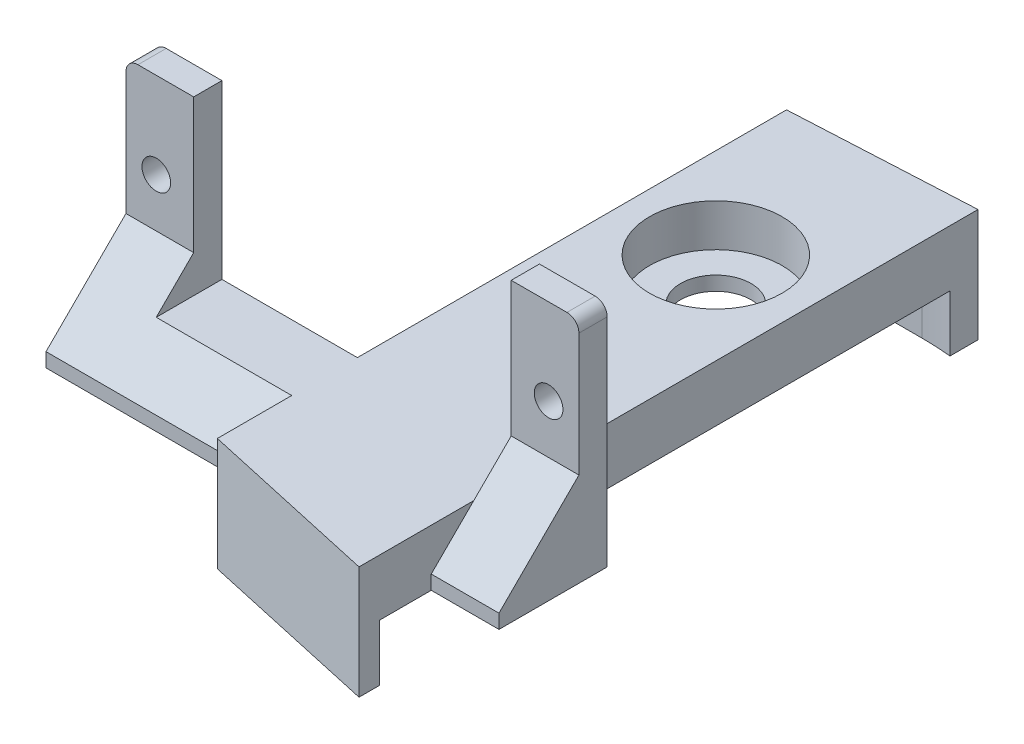
ISO-10303-21;
HEADER;
FILE_DESCRIPTION(('STEP AP214'),'2;1');
FILE_NAME('part.step','',(''),(''),'','','');
FILE_SCHEMA(('AUTOMOTIVE_DESIGN { 1 0 10303 214 1 1 1 1 }'));
ENDSEC;
DATA;
#1=APPLICATION_CONTEXT('core data for automotive mechanical design processes');
#2=APPLICATION_PROTOCOL_DEFINITION('international standard','automotive_design',2000,#1);
#3=PRODUCT_CONTEXT('',#1,'mechanical');
#4=PRODUCT('Part','Part','',(#3));
#5=PRODUCT_RELATED_PRODUCT_CATEGORY('part','',(#4));
#6=PRODUCT_DEFINITION_FORMATION('','',#4);
#7=PRODUCT_DEFINITION_CONTEXT('part definition',#1,'design');
#8=PRODUCT_DEFINITION('design','',#6,#7);
#9=PRODUCT_DEFINITION_SHAPE('','',#8);
#10=(LENGTH_UNIT() NAMED_UNIT(*) SI_UNIT(.MILLI.,.METRE.));
#11=(NAMED_UNIT(*) PLANE_ANGLE_UNIT() SI_UNIT($,.RADIAN.));
#12=(NAMED_UNIT(*) SI_UNIT($,.STERADIAN.) SOLID_ANGLE_UNIT());
#13=UNCERTAINTY_MEASURE_WITH_UNIT(LENGTH_MEASURE(1.E-05),#10,'distance_accuracy_value','');
#14=(GEOMETRIC_REPRESENTATION_CONTEXT(3) GLOBAL_UNCERTAINTY_ASSIGNED_CONTEXT((#13)) GLOBAL_UNIT_ASSIGNED_CONTEXT((#10,
#11,#12)) REPRESENTATION_CONTEXT('',''));
#15=CARTESIAN_POINT('',(0.,0.,0.));
#16=DIRECTION('',(0.,0.,1.));
#17=DIRECTION('',(1.,0.,0.));
#18=AXIS2_PLACEMENT_3D('',#15,#16,#17);
#19=CARTESIAN_POINT('',(24.0462381627888,-9.09999999999987,7.665828595555));
#20=DIRECTION('',(0.,-0.70856176119434,-0.705648801156195));
#21=DIRECTION('',(0.,0.705648801156195,-0.70856176119434));
#22=AXIS2_PLACEMENT_3D('',#19,#20,#21);
#23=PLANE('',#22);
#24=DIRECTION('',(0.,0.705648801156195,-0.70856176119434));
#25=VECTOR('',#24,1.);
#26=CARTESIAN_POINT('',(11.25,-9.09999999999994,7.665828595555));
#27=LINE('',#26,#25);
#28=CARTESIAN_POINT('',(11.25,-6.09999999999994,4.65344441790159));
#29=VERTEX_POINT('',#28);
#30=CARTESIAN_POINT('',(11.25,-3.45746412666863,2.));
#31=VERTEX_POINT('',#30);
#32=EDGE_CURVE('E11',#29,#31,#27,.T.);
#33=ORIENTED_EDGE('',*,*,#32,.F.);
#34=DIRECTION('',(0.,-0.705648801156195,0.70856176119434));
#35=VECTOR('',#34,1.);
#36=CARTESIAN_POINT('',(11.25,-5.26711822578882,3.8171244584051));
#37=LINE('',#36,#35);
#38=CARTESIAN_POINT('',(11.25,-9.09999999999994,7.665828595555));
#39=VERTEX_POINT('',#38);
#40=EDGE_CURVE('E325',#29,#39,#37,.T.);
#41=ORIENTED_EDGE('',*,*,#40,.T.);
#42=DIRECTION('',(-1.,0.,0.));
#43=VECTOR('',#42,1.);
#44=CARTESIAN_POINT('',(24.0462381627888,-9.09999999999987,7.665828595555));
#45=LINE('',#44,#43);
#46=CARTESIAN_POINT('',(16.05,-9.09999999999991,7.665828595555));
#47=VERTEX_POINT('',#46);
#48=EDGE_CURVE('E314',#47,#39,#45,.T.);
#49=ORIENTED_EDGE('',*,*,#48,.F.);
#50=DIRECTION('',(0.,0.705648801156195,-0.70856176119434));
#51=VECTOR('',#50,1.);
#52=CARTESIAN_POINT('',(16.05,-9.09999999999991,7.665828595555));
#53=LINE('',#52,#51);
#54=CARTESIAN_POINT('',(16.05,-3.45746412666861,2.));
#55=VERTEX_POINT('',#54);
#56=EDGE_CURVE('E320',#47,#55,#53,.T.);
#57=ORIENTED_EDGE('',*,*,#56,.T.);
#58=DIRECTION('',(-1.,0.,0.));
#59=VECTOR('',#58,1.);
#60=CARTESIAN_POINT('',(24.0462381627887,-3.45746412666856,2.));
#61=LINE('',#60,#59);
#62=EDGE_CURVE('E317',#55,#31,#61,.T.);
#63=ORIENTED_EDGE('',*,*,#62,.T.);
#64=EDGE_LOOP('',(#33,#41,#49,#57,#63));
#65=FACE_BOUND('',#64,.T.);
#66=ADVANCED_FACE('F35',(#65),#23,.F.);
#67=DIRECTION('',(0.,-0.705648801156195,0.70856176119434));
#68=VECTOR('',#67,1.);
#69=CARTESIAN_POINT('',(-11.25,-9.10000000000007,7.665828595555));
#70=LINE('',#69,#68);
#71=CARTESIAN_POINT('',(-11.25,-3.45746412666876,2.));
#72=VERTEX_POINT('',#71);
#73=CARTESIAN_POINT('',(-11.25,-6.10000000000007,4.65344441790159));
#74=VERTEX_POINT('',#73);
#75=EDGE_CURVE('E44',#72,#74,#70,.T.);
#76=ORIENTED_EDGE('',*,*,#75,.F.);
#77=CARTESIAN_POINT('',(-16.05,-3.45746412666879,2.));
#78=VERTEX_POINT('',#77);
#79=EDGE_CURVE('E316',#72,#78,#61,.T.);
#80=ORIENTED_EDGE('',*,*,#79,.T.);
#81=DIRECTION('',(0.,0.705648801156195,-0.70856176119434));
#82=VECTOR('',#81,1.);
#83=CARTESIAN_POINT('',(-16.05,-9.10000000000012,7.66582859555502));
#84=LINE('',#83,#82);
#85=CARTESIAN_POINT('',(-16.05,-9.1000000000001,7.665828595555));
#86=VERTEX_POINT('',#85);
#87=EDGE_CURVE('E310',#86,#78,#84,.T.);
#88=ORIENTED_EDGE('',*,*,#87,.F.);
#89=CARTESIAN_POINT('',(-1.64999999999999,-9.10000000000001,7.665828595555));
#90=VERTEX_POINT('',#89);
#91=EDGE_CURVE('E313',#90,#86,#45,.T.);
#92=ORIENTED_EDGE('',*,*,#91,.F.);
#93=DIRECTION('',(0.,0.705648801156195,-0.70856176119434));
#94=VECTOR('',#93,1.);
#95=CARTESIAN_POINT('',(-1.65000000000002,-5.2671182257889,3.8171244584051));
#96=LINE('',#95,#94);
#97=CARTESIAN_POINT('',(-1.65000000000001,-6.10000000000001,4.65344441790159));
#98=VERTEX_POINT('',#97);
#99=EDGE_CURVE('E322',#90,#98,#96,.T.);
#100=ORIENTED_EDGE('',*,*,#99,.T.);
#101=DIRECTION('',(1.,0.,0.));
#102=VECTOR('',#101,1.);
#103=CARTESIAN_POINT('',(24.0462381627888,-6.09999999999987,4.65344441790159));
#104=LINE('',#103,#102);
#105=EDGE_CURVE('E476',#74,#98,#104,.T.);
#106=ORIENTED_EDGE('',*,*,#105,.F.);
#107=EDGE_LOOP('',(#76,#80,#88,#92,#100,#106));
#108=FACE_BOUND('',#107,.T.);
#109=ADVANCED_FACE('F484',(#108),#23,.F.);
#110=CARTESIAN_POINT('',(0.,0.,2.));
#111=DIRECTION('',(0.,0.,1.));
#112=DIRECTION('',(1.,0.,0.));
#113=AXIS2_PLACEMENT_3D('',#110,#111,#112);
#114=PLANE('',#113);
#115=CARTESIAN_POINT('',(-13.9,0.,2.));
#116=DIRECTION('',(0.,0.,1.));
#117=DIRECTION('',(1.,0.,0.));
#118=AXIS2_PLACEMENT_3D('',#115,#116,#117);
#119=CIRCLE('',#118,1.016);
#120=CARTESIAN_POINT('',(-12.884,0.,2.));
#121=VERTEX_POINT('',#120);
#122=EDGE_CURVE('E450',#121,#121,#119,.T.);
#123=ORIENTED_EDGE('',*,*,#122,.F.);
#124=EDGE_LOOP('',(#123));
#125=FACE_BOUND('',#124,.T.);
#126=DIRECTION('',(0.,-1.,0.));
#127=VECTOR('',#126,1.);
#128=CARTESIAN_POINT('',(-16.05,0.,2.));
#129=LINE('',#128,#127);
#130=CARTESIAN_POINT('',(-16.05,5.25,2.));
#131=VERTEX_POINT('',#130);
#132=EDGE_CURVE('E453',#131,#78,#129,.T.);
#133=ORIENTED_EDGE('',*,*,#132,.T.);
#134=ORIENTED_EDGE('',*,*,#79,.F.);
#135=DIRECTION('',(0.,-1.,0.));
#136=VECTOR('',#135,1.);
#137=CARTESIAN_POINT('',(-11.25,0.,2.));
#138=LINE('',#137,#136);
#139=CARTESIAN_POINT('',(-11.25,6.1,2.));
#140=VERTEX_POINT('',#139);
#141=EDGE_CURVE('E455',#140,#72,#138,.T.);
#142=ORIENTED_EDGE('',*,*,#141,.F.);
#143=DIRECTION('',(-1.,0.,0.));
#144=VECTOR('',#143,1.);
#145=CARTESIAN_POINT('',(0.,6.1,2.));
#146=LINE('',#145,#144);
#147=CARTESIAN_POINT('',(-15.2,6.1,2.));
#148=VERTEX_POINT('',#147);
#149=EDGE_CURVE('E457',#140,#148,#146,.T.);
#150=ORIENTED_EDGE('',*,*,#149,.T.);
#151=CARTESIAN_POINT('',(-15.2,5.25,2.));
#152=DIRECTION('',(0.,0.,1.));
#153=DIRECTION('',(1.,0.,0.));
#154=AXIS2_PLACEMENT_3D('',#151,#152,#153);
#155=CIRCLE('',#154,0.850000000000002);
#156=EDGE_CURVE('E52',#148,#131,#155,.T.);
#157=ORIENTED_EDGE('',*,*,#156,.T.);
#158=EDGE_LOOP('',(#133,#134,#142,#150,#157));
#159=FACE_BOUND('',#158,.T.);
#160=ADVANCED_FACE('F580',(#125,#159),#114,.T.);
#161=CARTESIAN_POINT('',(0.,-9.1,2.));
#162=DIRECTION('',(0.,0.,-1.));
#163=DIRECTION('',(-1.,0.,0.));
#164=AXIS2_PLACEMENT_3D('',#161,#162,#163);
#165=PLANE('',#164);
#166=CARTESIAN_POINT('',(13.9,0.,2.));
#167=DIRECTION('',(0.,0.,1.));
#168=DIRECTION('',(1.,0.,0.));
#169=AXIS2_PLACEMENT_3D('',#166,#167,#168);
#170=CIRCLE('',#169,1.016);
#171=CARTESIAN_POINT('',(14.916,0.,2.));
#172=VERTEX_POINT('',#171);
#173=EDGE_CURVE('E383',#172,#172,#170,.T.);
#174=ORIENTED_EDGE('',*,*,#173,.F.);
#175=EDGE_LOOP('',(#174));
#176=FACE_BOUND('',#175,.T.);
#177=ORIENTED_EDGE('',*,*,#62,.F.);
#178=DIRECTION('',(0.,1.,0.));
#179=VECTOR('',#178,1.);
#180=CARTESIAN_POINT('',(16.05,-9.09999999999991,2.));
#181=LINE('',#180,#179);
#182=CARTESIAN_POINT('',(16.05,5.25,2.));
#183=VERTEX_POINT('',#182);
#184=EDGE_CURVE('E439',#55,#183,#181,.T.);
#185=ORIENTED_EDGE('',*,*,#184,.T.);
#186=CARTESIAN_POINT('',(15.2,5.25,2.));
#187=DIRECTION('',(0.,0.,1.));
#188=DIRECTION('',(1.,0.,0.));
#189=AXIS2_PLACEMENT_3D('',#186,#187,#188);
#190=CIRCLE('',#189,0.849999999999998);
#191=CARTESIAN_POINT('',(15.2,6.1,2.));
#192=VERTEX_POINT('',#191);
#193=EDGE_CURVE('E386',#183,#192,#190,.T.);
#194=ORIENTED_EDGE('',*,*,#193,.T.);
#195=DIRECTION('',(0.999998883397845,0.00149439053219066,0.));
#196=VECTOR('',#195,1.);
#197=CARTESIAN_POINT('',(-0.00908182738110785,6.07727166673534,2.));
#198=LINE('',#197,#196);
#199=CARTESIAN_POINT('',(11.25,6.09409715080671,2.));
#200=VERTEX_POINT('',#199);
#201=EDGE_CURVE('E389',#200,#192,#198,.T.);
#202=ORIENTED_EDGE('',*,*,#201,.F.);
#203=DIRECTION('',(0.,1.,0.));
#204=VECTOR('',#203,1.);
#205=CARTESIAN_POINT('',(11.25,0.,2.));
#206=LINE('',#205,#204);
#207=EDGE_CURVE('E392',#31,#200,#206,.T.);
#208=ORIENTED_EDGE('',*,*,#207,.F.);
#209=EDGE_LOOP('',(#177,#185,#194,#202,#208));
#210=FACE_BOUND('',#209,.T.);
#211=ADVANCED_FACE('F533',(#176,#210),#165,.F.);
#212=CARTESIAN_POINT('',(11.25,-9.09999999999994,0.));
#213=DIRECTION('',(-1.,0.,0.));
#214=DIRECTION('',(0.,-1.,0.));
#215=AXIS2_PLACEMENT_3D('',#212,#213,#214);
#216=PLANE('',#215);
#217=ORIENTED_EDGE('',*,*,#40,.F.);
#218=DIRECTION('',(0.,0.,1.));
#219=VECTOR('',#218,1.);
#220=CARTESIAN_POINT('',(11.25,-6.09999999999994,0.));
#221=LINE('',#220,#219);
#222=CARTESIAN_POINT('',(11.25,-6.09999999999994,12.7845078967488));
#223=VERTEX_POINT('',#222);
#224=EDGE_CURVE('E419',#29,#223,#221,.T.);
#225=ORIENTED_EDGE('',*,*,#224,.T.);
#226=DIRECTION('',(0.,1.,0.));
#227=VECTOR('',#226,1.);
#228=CARTESIAN_POINT('',(11.25,-9.09999999999994,12.7845078967488));
#229=LINE('',#228,#227);
#230=CARTESIAN_POINT('',(11.2500000000001,-14.0999999999999,12.7845078967488));
#231=VERTEX_POINT('',#230);
#232=EDGE_CURVE('E436',#231,#223,#229,.T.);
#233=ORIENTED_EDGE('',*,*,#232,.F.);
#234=DIRECTION('',(0.,0.,1.));
#235=VECTOR('',#234,1.);
#236=CARTESIAN_POINT('',(11.2500000000001,-14.0999999999999,0.));
#237=LINE('',#236,#235);
#238=CARTESIAN_POINT('',(11.2500000000001,-14.0999999999999,11.3374766221739));
#239=VERTEX_POINT('',#238);
#240=EDGE_CURVE('E362',#239,#231,#237,.T.);
#241=ORIENTED_EDGE('',*,*,#240,.F.);
#242=DIRECTION('',(0.,1.,0.));
#243=VECTOR('',#242,1.);
#244=CARTESIAN_POINT('',(11.2500000000001,-14.0999999999999,11.3374766221739));
#245=LINE('',#244,#243);
#246=CARTESIAN_POINT('',(11.25,-10.0999999999999,11.3374766221739));
#247=VERTEX_POINT('',#246);
#248=EDGE_CURVE('E373',#239,#247,#245,.T.);
#249=ORIENTED_EDGE('',*,*,#248,.T.);
#250=DIRECTION('',(0.,0.,1.));
#251=VECTOR('',#250,1.);
#252=CARTESIAN_POINT('',(11.25,-10.0999999999999,7.665828595555));
#253=LINE('',#252,#251);
#254=CARTESIAN_POINT('',(11.25,-10.0999999999999,7.665828595555));
#255=VERTEX_POINT('',#254);
#256=EDGE_CURVE('E284',#255,#247,#253,.T.);
#257=ORIENTED_EDGE('',*,*,#256,.F.);
#258=DIRECTION('',(0.,1.,0.));
#259=VECTOR('',#258,1.);
#260=CARTESIAN_POINT('',(11.25,-10.0999999999999,7.665828595555));
#261=LINE('',#260,#259);
#262=EDGE_CURVE('E302',#255,#39,#261,.T.);
#263=ORIENTED_EDGE('',*,*,#262,.T.);
#264=EDGE_LOOP('',(#217,#225,#233,#241,#249,#257,#263));
#265=FACE_BOUND('',#264,.T.);
#266=ADVANCED_FACE('F546',(#265),#216,.F.);
#267=CARTESIAN_POINT('',(-1.65,-9.10000000000001,0.));
#268=DIRECTION('',(1.,0.,0.));
#269=DIRECTION('',(0.,1.,0.));
#270=AXIS2_PLACEMENT_3D('',#267,#268,#269);
#271=PLANE('',#270);
#272=DIRECTION('',(0.,1.,0.));
#273=VECTOR('',#272,1.);
#274=CARTESIAN_POINT('',(-1.64999999999999,-10.1,7.665828595555));
#275=LINE('',#274,#273);
#276=CARTESIAN_POINT('',(-1.64999999999999,-10.1,7.665828595555));
#277=VERTEX_POINT('',#276);
#278=EDGE_CURVE('E300',#277,#90,#275,.T.);
#279=ORIENTED_EDGE('',*,*,#278,.F.);
#280=DIRECTION('',(0.,0.,1.));
#281=VECTOR('',#280,1.);
#282=CARTESIAN_POINT('',(-1.64999999999999,-10.1,7.13452779662228));
#283=LINE('',#282,#281);
#284=CARTESIAN_POINT('',(-1.64999999999999,-10.1,7.13452779662228));
#285=VERTEX_POINT('',#284);
#286=EDGE_CURVE('E292',#285,#277,#283,.T.);
#287=ORIENTED_EDGE('',*,*,#286,.F.);
#288=DIRECTION('',(0.,1.,0.));
#289=VECTOR('',#288,1.);
#290=CARTESIAN_POINT('',(-1.64999999999997,-14.1,7.13452779661489));
#291=LINE('',#290,#289);
#292=CARTESIAN_POINT('',(-1.64999999999997,-14.1,7.13452779661489));
#293=VERTEX_POINT('',#292);
#294=EDGE_CURVE('E370',#293,#285,#291,.T.);
#295=ORIENTED_EDGE('',*,*,#294,.F.);
#296=DIRECTION('',(0.,0.,-1.));
#297=VECTOR('',#296,1.);
#298=CARTESIAN_POINT('',(-1.64999999999997,-14.1,0.));
#299=LINE('',#298,#297);
#300=CARTESIAN_POINT('',(-1.64999999999997,-14.1,9.92544963904263));
#301=VERTEX_POINT('',#300);
#302=EDGE_CURVE('E368',#301,#293,#299,.T.);
#303=ORIENTED_EDGE('',*,*,#302,.F.);
#304=DIRECTION('',(0.,1.,0.));
#305=VECTOR('',#304,1.);
#306=CARTESIAN_POINT('',(-1.65,-9.10000000000001,9.92544963904263));
#307=LINE('',#306,#305);
#308=CARTESIAN_POINT('',(-1.65000000000002,-6.10000000000001,9.92544963904263));
#309=VERTEX_POINT('',#308);
#310=EDGE_CURVE('E245',#301,#309,#307,.T.);
#311=ORIENTED_EDGE('',*,*,#310,.T.);
#312=DIRECTION('',(0.,0.,-1.));
#313=VECTOR('',#312,1.);
#314=CARTESIAN_POINT('',(-1.65000000000001,-6.10000000000001,0.));
#315=LINE('',#314,#313);
#316=EDGE_CURVE('E424',#309,#98,#315,.T.);
#317=ORIENTED_EDGE('',*,*,#316,.T.);
#318=ORIENTED_EDGE('',*,*,#99,.F.);
#319=EDGE_LOOP('',(#279,#287,#295,#303,#311,#317,#318));
#320=FACE_BOUND('',#319,.T.);
#321=ADVANCED_FACE('F568',(#320),#271,.F.);
#322=CARTESIAN_POINT('',(0.,-6.1,0.));
#323=DIRECTION('',(0.,-1.,0.));
#324=DIRECTION('',(1.,0.,0.));
#325=AXIS2_PLACEMENT_3D('',#322,#323,#324);
#326=PLANE('',#325);
#327=DIRECTION('',(0.,0.,-1.));
#328=VECTOR('',#327,1.);
#329=CARTESIAN_POINT('',(11.25,-6.1,2.));
#330=LINE('',#329,#328);
#331=CARTESIAN_POINT('',(11.25,-6.1,0.));
#332=VERTEX_POINT('',#331);
#333=EDGE_CURVE('E394',#29,#332,#330,.T.);
#334=ORIENTED_EDGE('',*,*,#333,.T.);
#335=DIRECTION('',(0.,0.,-1.));
#336=VECTOR('',#335,1.);
#337=CARTESIAN_POINT('',(11.25,-6.09999999999994,0.));
#338=LINE('',#337,#336);
#339=CARTESIAN_POINT('',(11.25,-6.09999999999994,-31.0791904578283));
#340=VERTEX_POINT('',#339);
#341=EDGE_CURVE('E417',#332,#340,#338,.T.);
#342=ORIENTED_EDGE('',*,*,#341,.T.);
#343=DIRECTION('',(0.998658541535992,0.,-0.0517795076956585));
#344=VECTOR('',#343,1.);
#345=CARTESIAN_POINT('',(-1.57694384814383,-6.10000000000001,-30.4141254630652));
#346=LINE('',#345,#344);
#347=CARTESIAN_POINT('',(-1.65000000000001,-6.10000000000001,-30.410337570187));
#348=VERTEX_POINT('',#347);
#349=EDGE_CURVE('E414',#348,#340,#346,.T.);
#350=ORIENTED_EDGE('',*,*,#349,.F.);
#351=DIRECTION('',(0.,0.,-1.));
#352=VECTOR('',#351,1.);
#353=CARTESIAN_POINT('',(-1.65000000000001,-6.10000000000001,0.));
#354=LINE('',#353,#352);
#355=CARTESIAN_POINT('',(-1.65000000000001,-6.10000000000001,0.));
#356=VERTEX_POINT('',#355);
#357=EDGE_CURVE('E428',#356,#348,#354,.T.);
#358=ORIENTED_EDGE('',*,*,#357,.F.);
#359=DIRECTION('',(-1.,0.,0.));
#360=VECTOR('',#359,1.);
#361=CARTESIAN_POINT('',(0.,-6.1,0.));
#362=LINE('',#361,#360);
#363=CARTESIAN_POINT('',(-11.25,-6.1,0.));
#364=VERTEX_POINT('',#363);
#365=EDGE_CURVE('E242',#356,#364,#362,.T.);
#366=ORIENTED_EDGE('',*,*,#365,.T.);
#367=DIRECTION('',(0.,0.,-1.));
#368=VECTOR('',#367,1.);
#369=CARTESIAN_POINT('',(-11.25,-6.1,2.));
#370=LINE('',#369,#368);
#371=EDGE_CURVE('E473',#74,#364,#370,.T.);
#372=ORIENTED_EDGE('',*,*,#371,.F.);
#373=ORIENTED_EDGE('',*,*,#105,.T.);
#374=ORIENTED_EDGE('',*,*,#316,.F.);
#375=DIRECTION('',(0.976308845609263,0.,0.216381695124861));
#376=VECTOR('',#375,1.);
#377=CARTESIAN_POINT('',(-2.17405917889447,-6.10000000000002,9.80930113338799));
#378=LINE('',#377,#376);
#379=EDGE_CURVE('E421',#309,#223,#378,.T.);
#380=ORIENTED_EDGE('',*,*,#379,.T.);
#381=ORIENTED_EDGE('',*,*,#224,.F.);
#382=EDGE_LOOP('',(#334,#342,#350,#358,#366,#372,#373,#374,#380,#381));
#383=FACE_BOUND('',#382,.T.);
#384=CARTESIAN_POINT('',(4.74999999999999,-6.09999999999998,-19.));
#385=DIRECTION('',(0.,-1.,0.));
#386=DIRECTION('',(1.,0.,0.));
#387=AXIS2_PLACEMENT_3D('',#384,#385,#386);
#388=CIRCLE('',#387,4.7);
#389=CARTESIAN_POINT('',(9.44999999999999,-6.09999999999995,-19.));
#390=VERTEX_POINT('',#389);
#391=EDGE_CURVE('E430',#390,#390,#388,.T.);
#392=ORIENTED_EDGE('',*,*,#391,.T.);
#393=EDGE_LOOP('',(#392));
#394=FACE_BOUND('',#393,.T.);
#395=ADVANCED_FACE('F489',(#383,#394),#326,.F.);
#396=CARTESIAN_POINT('',(-16.05,0.,2.));
#397=DIRECTION('',(1.,0.,0.));
#398=DIRECTION('',(0.,1.,0.));
#399=AXIS2_PLACEMENT_3D('',#396,#397,#398);
#400=PLANE('',#399);
#401=DIRECTION('',(0.,-1.,0.));
#402=VECTOR('',#401,1.);
#403=CARTESIAN_POINT('',(-16.05,0.,0.));
#404=LINE('',#403,#402);
#405=CARTESIAN_POINT('',(-16.05,5.25,0.));
#406=VERTEX_POINT('',#405);
#407=CARTESIAN_POINT('',(-16.05,-10.1000000000001,0.));
#408=VERTEX_POINT('',#407);
#409=EDGE_CURVE('E463',#406,#408,#404,.T.);
#410=ORIENTED_EDGE('',*,*,#409,.T.);
#411=DIRECTION('',(0.,0.,-1.));
#412=VECTOR('',#411,1.);
#413=CARTESIAN_POINT('',(-16.05,-10.1000000000001,7.665828595555));
#414=LINE('',#413,#412);
#415=CARTESIAN_POINT('',(-16.05,-10.1000000000001,7.665828595555));
#416=VERTEX_POINT('',#415);
#417=EDGE_CURVE('E261',#416,#408,#414,.T.);
#418=ORIENTED_EDGE('',*,*,#417,.F.);
#419=DIRECTION('',(0.,1.,0.));
#420=VECTOR('',#419,1.);
#421=CARTESIAN_POINT('',(-16.05,-10.1000000000001,7.665828595555));
#422=LINE('',#421,#420);
#423=EDGE_CURVE('E297',#416,#86,#422,.T.);
#424=ORIENTED_EDGE('',*,*,#423,.T.);
#425=ORIENTED_EDGE('',*,*,#87,.T.);
#426=ORIENTED_EDGE('',*,*,#132,.F.);
#427=DIRECTION('',(0.,0.,-1.));
#428=VECTOR('',#427,1.);
#429=CARTESIAN_POINT('',(-16.05,5.25,2.));
#430=LINE('',#429,#428);
#431=EDGE_CURVE('E460',#131,#406,#430,.T.);
#432=ORIENTED_EDGE('',*,*,#431,.T.);
#433=EDGE_LOOP('',(#410,#418,#424,#425,#426,#432));
#434=FACE_BOUND('',#433,.T.);
#435=ADVANCED_FACE('F576',(#434),#400,.F.);
#436=CARTESIAN_POINT('',(-11.25,0.,2.));
#437=DIRECTION('',(1.,0.,0.));
#438=DIRECTION('',(0.,1.,0.));
#439=AXIS2_PLACEMENT_3D('',#436,#437,#438);
#440=PLANE('',#439);
#441=ORIENTED_EDGE('',*,*,#141,.T.);
#442=ORIENTED_EDGE('',*,*,#75,.T.);
#443=ORIENTED_EDGE('',*,*,#371,.T.);
#444=DIRECTION('',(0.,-1.,0.));
#445=VECTOR('',#444,1.);
#446=CARTESIAN_POINT('',(-11.25,0.,0.));
#447=LINE('',#446,#445);
#448=CARTESIAN_POINT('',(-11.25,6.1,0.));
#449=VERTEX_POINT('',#448);
#450=EDGE_CURVE('E465',#449,#364,#447,.T.);
#451=ORIENTED_EDGE('',*,*,#450,.F.);
#452=DIRECTION('',(0.,0.,-1.));
#453=VECTOR('',#452,1.);
#454=CARTESIAN_POINT('',(-11.25,6.1,2.));
#455=LINE('',#454,#453);
#456=EDGE_CURVE('E80',#140,#449,#455,.T.);
#457=ORIENTED_EDGE('',*,*,#456,.F.);
#458=EDGE_LOOP('',(#441,#442,#443,#451,#457));
#459=FACE_BOUND('',#458,.T.);
#460=ADVANCED_FACE('F480',(#459),#440,.T.);
#461=CARTESIAN_POINT('',(0.,6.1,2.));
#462=DIRECTION('',(0.,-1.,0.));
#463=DIRECTION('',(0.,0.,-1.));
#464=AXIS2_PLACEMENT_3D('',#461,#462,#463);
#465=PLANE('',#464);
#466=DIRECTION('',(-1.,0.,0.));
#467=VECTOR('',#466,1.);
#468=CARTESIAN_POINT('',(0.,6.1,0.));
#469=LINE('',#468,#467);
#470=CARTESIAN_POINT('',(-15.2,6.1,0.));
#471=VERTEX_POINT('',#470);
#472=EDGE_CURVE('E69',#449,#471,#469,.T.);
#473=ORIENTED_EDGE('',*,*,#472,.T.);
#474=DIRECTION('',(0.,0.,-1.));
#475=VECTOR('',#474,1.);
#476=CARTESIAN_POINT('',(-15.2,6.1,2.));
#477=LINE('',#476,#475);
#478=EDGE_CURVE('E470',#148,#471,#477,.T.);
#479=ORIENTED_EDGE('',*,*,#478,.F.);
#480=ORIENTED_EDGE('',*,*,#149,.F.);
#481=ORIENTED_EDGE('',*,*,#456,.T.);
#482=EDGE_LOOP('',(#473,#479,#480,#481));
#483=FACE_BOUND('',#482,.T.);
#484=ADVANCED_FACE('F579',(#483),#465,.F.);
#485=CARTESIAN_POINT('',(-13.9,0.,2.));
#486=DIRECTION('',(0.,0.,-1.));
#487=DIRECTION('',(-1.,0.,0.));
#488=AXIS2_PLACEMENT_3D('',#485,#486,#487);
#489=CYLINDRICAL_SURFACE('',#488,1.016);
#490=ORIENTED_EDGE('',*,*,#122,.T.);
#491=EDGE_LOOP('',(#490));
#492=FACE_BOUND('',#491,.T.);
#493=CARTESIAN_POINT('',(-13.9,0.,0.));
#494=DIRECTION('',(0.,0.,1.));
#495=DIRECTION('',(1.,0.,0.));
#496=AXIS2_PLACEMENT_3D('',#493,#494,#495);
#497=CIRCLE('',#496,1.016);
#498=CARTESIAN_POINT('',(-12.884,0.,0.));
#499=VERTEX_POINT('',#498);
#500=EDGE_CURVE('E449',#499,#499,#497,.T.);
#501=ORIENTED_EDGE('',*,*,#500,.F.);
#502=EDGE_LOOP('',(#501));
#503=FACE_BOUND('',#502,.T.);
#504=ADVANCED_FACE('F37',(#492,#503),#489,.F.);
#505=CARTESIAN_POINT('',(-15.2,5.25,2.));
#506=DIRECTION('',(0.,0.,-1.));
#507=DIRECTION('',(-1.,0.,0.));
#508=AXIS2_PLACEMENT_3D('',#505,#506,#507);
#509=CYLINDRICAL_SURFACE('',#508,0.850000000000002);
#510=CARTESIAN_POINT('',(-15.2,5.25,0.));
#511=DIRECTION('',(0.,0.,1.));
#512=DIRECTION('',(1.,0.,0.));
#513=AXIS2_PLACEMENT_3D('',#510,#511,#512);
#514=CIRCLE('',#513,0.850000000000002);
#515=EDGE_CURVE('E74',#471,#406,#514,.T.);
#516=ORIENTED_EDGE('',*,*,#515,.T.);
#517=ORIENTED_EDGE('',*,*,#431,.F.);
#518=ORIENTED_EDGE('',*,*,#156,.F.);
#519=ORIENTED_EDGE('',*,*,#478,.T.);
#520=EDGE_LOOP('',(#516,#517,#518,#519));
#521=FACE_BOUND('',#520,.T.);
#522=ADVANCED_FACE('F578',(#521),#509,.T.);
#523=CARTESIAN_POINT('',(0.,0.,0.));
#524=DIRECTION('',(0.,0.,1.));
#525=DIRECTION('',(1.,0.,0.));
#526=AXIS2_PLACEMENT_3D('',#523,#524,#525);
#527=PLANE('',#526);
#528=ORIENTED_EDGE('',*,*,#500,.T.);
#529=EDGE_LOOP('',(#528));
#530=FACE_BOUND('',#529,.T.);
#531=ORIENTED_EDGE('',*,*,#409,.F.);
#532=ORIENTED_EDGE('',*,*,#515,.F.);
#533=ORIENTED_EDGE('',*,*,#472,.F.);
#534=ORIENTED_EDGE('',*,*,#450,.T.);
#535=ORIENTED_EDGE('',*,*,#365,.F.);
#536=DIRECTION('',(0.,1.,0.));
#537=VECTOR('',#536,1.);
#538=CARTESIAN_POINT('',(-1.65,-9.10000000000001,0.));
#539=LINE('',#538,#537);
#540=CARTESIAN_POINT('',(-1.64999999999999,-10.1,0.));
#541=VERTEX_POINT('',#540);
#542=EDGE_CURVE('E235',#541,#356,#539,.T.);
#543=ORIENTED_EDGE('',*,*,#542,.F.);
#544=DIRECTION('',(1.,0.,0.));
#545=VECTOR('',#544,1.);
#546=CARTESIAN_POINT('',(-16.05,-10.1000000000001,0.));
#547=LINE('',#546,#545);
#548=EDGE_CURVE('E240',#408,#541,#547,.T.);
#549=ORIENTED_EDGE('',*,*,#548,.F.);
#550=EDGE_LOOP('',(#531,#532,#533,#534,#535,#543,#549));
#551=FACE_BOUND('',#550,.T.);
#552=ADVANCED_FACE('F238',(#530,#551),#527,.F.);
#553=CARTESIAN_POINT('',(-1.57694384814381,-9.10000000000001,-30.4141254630652));
#554=DIRECTION('',(0.0517795076956585,0.,0.998658541535992));
#555=DIRECTION('',(0.998658541535992,0.,-0.0517795076956585));
#556=AXIS2_PLACEMENT_3D('',#553,#554,#555);
#557=PLANE('',#556);
#558=ORIENTED_EDGE('',*,*,#349,.T.);
#559=DIRECTION('',(0.,1.,0.));
#560=VECTOR('',#559,1.);
#561=CARTESIAN_POINT('',(11.25,-9.09999999999994,-31.0791904578283));
#562=LINE('',#561,#560);
#563=CARTESIAN_POINT('',(11.2500000000001,-14.0999999999999,-31.0791904578283));
#564=VERTEX_POINT('',#563);
#565=EDGE_CURVE('E446',#564,#340,#562,.T.);
#566=ORIENTED_EDGE('',*,*,#565,.F.);
#567=DIRECTION('',(0.998658541535992,0.,-0.0517795076956585));
#568=VECTOR('',#567,1.);
#569=CARTESIAN_POINT('',(-1.57694384814378,-14.1,-30.4141254630652));
#570=LINE('',#569,#568);
#571=CARTESIAN_POINT('',(-1.64999999999997,-14.1,-30.410337570187));
#572=VERTEX_POINT('',#571);
#573=EDGE_CURVE('E339',#572,#564,#570,.T.);
#574=ORIENTED_EDGE('',*,*,#573,.F.);
#575=DIRECTION('',(0.,1.,0.));
#576=VECTOR('',#575,1.);
#577=CARTESIAN_POINT('',(-1.64999999999999,-9.10000000000001,-30.410337570187));
#578=LINE('',#577,#576);
#579=EDGE_CURVE('E246',#572,#348,#578,.T.);
#580=ORIENTED_EDGE('',*,*,#579,.T.);
#581=EDGE_LOOP('',(#558,#566,#574,#580));
#582=FACE_BOUND('',#581,.T.);
#583=ADVANCED_FACE('F495',(#582),#557,.F.);
#584=CARTESIAN_POINT('',(11.25,-9.09999999999994,0.));
#585=DIRECTION('',(1.,0.,0.));
#586=DIRECTION('',(0.,1.,0.));
#587=AXIS2_PLACEMENT_3D('',#584,#585,#586);
#588=PLANE('',#587);
#589=DIRECTION('',(0.,1.,0.));
#590=VECTOR('',#589,1.);
#591=CARTESIAN_POINT('',(11.25,-9.09999999999994,0.));
#592=LINE('',#591,#590);
#593=CARTESIAN_POINT('',(11.25,-10.0999999999999,0.));
#594=VERTEX_POINT('',#593);
#595=EDGE_CURVE('E443',#594,#332,#592,.T.);
#596=ORIENTED_EDGE('',*,*,#595,.F.);
#597=DIRECTION('',(0.,0.,1.));
#598=VECTOR('',#597,1.);
#599=CARTESIAN_POINT('',(11.25,-10.0999999999999,-29.0905425544606));
#600=LINE('',#599,#598);
#601=CARTESIAN_POINT('',(11.25,-10.0999999999999,-29.0905425544606));
#602=VERTEX_POINT('',#601);
#603=EDGE_CURVE('E274',#602,#594,#600,.T.);
#604=ORIENTED_EDGE('',*,*,#603,.F.);
#605=DIRECTION('',(0.,1.,0.));
#606=VECTOR('',#605,1.);
#607=CARTESIAN_POINT('',(11.2500000000001,-14.0999999999999,-29.0905425544606));
#608=LINE('',#607,#606);
#609=CARTESIAN_POINT('',(11.2500000000001,-14.0999999999999,-29.0905425544606));
#610=VERTEX_POINT('',#609);
#611=EDGE_CURVE('E345',#610,#602,#608,.T.);
#612=ORIENTED_EDGE('',*,*,#611,.F.);
#613=DIRECTION('',(0.,0.,-1.));
#614=VECTOR('',#613,1.);
#615=CARTESIAN_POINT('',(11.2500000000001,-14.0999999999999,0.));
#616=LINE('',#615,#614);
#617=EDGE_CURVE('E342',#610,#564,#616,.T.);
#618=ORIENTED_EDGE('',*,*,#617,.T.);
#619=ORIENTED_EDGE('',*,*,#565,.T.);
#620=ORIENTED_EDGE('',*,*,#341,.F.);
#621=EDGE_LOOP('',(#596,#604,#612,#618,#619,#620));
#622=FACE_BOUND('',#621,.T.);
#623=ADVANCED_FACE('F502',(#622),#588,.T.);
#624=CARTESIAN_POINT('',(0.,-9.1,0.));
#625=DIRECTION('',(0.,0.,1.));
#626=DIRECTION('',(1.,0.,0.));
#627=AXIS2_PLACEMENT_3D('',#624,#625,#626);
#628=PLANE('',#627);
#629=ORIENTED_EDGE('',*,*,#595,.T.);
#630=DIRECTION('',(0.,1.,0.));
#631=VECTOR('',#630,1.);
#632=CARTESIAN_POINT('',(11.25,0.,0.));
#633=LINE('',#632,#631);
#634=CARTESIAN_POINT('',(11.25,6.09409715080671,0.));
#635=VERTEX_POINT('',#634);
#636=EDGE_CURVE('E387',#332,#635,#633,.T.);
#637=ORIENTED_EDGE('',*,*,#636,.T.);
#638=DIRECTION('',(0.999998883397845,0.00149439053219066,0.));
#639=VECTOR('',#638,1.);
#640=CARTESIAN_POINT('',(-0.00908182738110785,6.07727166673534,0.));
#641=LINE('',#640,#639);
#642=CARTESIAN_POINT('',(15.2,6.1,0.));
#643=VERTEX_POINT('',#642);
#644=EDGE_CURVE('E400',#635,#643,#641,.T.);
#645=ORIENTED_EDGE('',*,*,#644,.T.);
#646=CARTESIAN_POINT('',(15.2,5.25,0.));
#647=DIRECTION('',(0.,0.,1.));
#648=DIRECTION('',(1.,0.,0.));
#649=AXIS2_PLACEMENT_3D('',#646,#647,#648);
#650=CIRCLE('',#649,0.849999999999998);
#651=CARTESIAN_POINT('',(16.05,5.25,0.));
#652=VERTEX_POINT('',#651);
#653=EDGE_CURVE('E397',#652,#643,#650,.T.);
#654=ORIENTED_EDGE('',*,*,#653,.F.);
#655=DIRECTION('',(0.,1.,0.));
#656=VECTOR('',#655,1.);
#657=CARTESIAN_POINT('',(16.05,-9.09999999999991,0.));
#658=LINE('',#657,#656);
#659=CARTESIAN_POINT('',(16.05,-10.0999999999999,0.));
#660=VERTEX_POINT('',#659);
#661=EDGE_CURVE('E441',#660,#652,#658,.T.);
#662=ORIENTED_EDGE('',*,*,#661,.F.);
#663=DIRECTION('',(1.,0.,0.));
#664=VECTOR('',#663,1.);
#665=CARTESIAN_POINT('',(11.25,-10.0999999999999,0.));
#666=LINE('',#665,#664);
#667=EDGE_CURVE('E277',#594,#660,#666,.T.);
#668=ORIENTED_EDGE('',*,*,#667,.F.);
#669=EDGE_LOOP('',(#629,#637,#645,#654,#662,#668));
#670=FACE_BOUND('',#669,.T.);
#671=CARTESIAN_POINT('',(13.9,0.,0.));
#672=DIRECTION('',(0.,0.,1.));
#673=DIRECTION('',(1.,0.,0.));
#674=AXIS2_PLACEMENT_3D('',#671,#672,#673);
#675=CIRCLE('',#674,1.016);
#676=CARTESIAN_POINT('',(14.916,0.,0.));
#677=VERTEX_POINT('',#676);
#678=EDGE_CURVE('E382',#677,#677,#675,.T.);
#679=ORIENTED_EDGE('',*,*,#678,.T.);
#680=EDGE_LOOP('',(#679));
#681=FACE_BOUND('',#680,.T.);
#682=ADVANCED_FACE('F518',(#670,#681),#628,.F.);
#683=CARTESIAN_POINT('',(16.05,-9.09999999999991,0.));
#684=DIRECTION('',(-1.,0.,0.));
#685=DIRECTION('',(0.,-1.,0.));
#686=AXIS2_PLACEMENT_3D('',#683,#684,#685);
#687=PLANE('',#686);
#688=ORIENTED_EDGE('',*,*,#661,.T.);
#689=DIRECTION('',(0.,0.,-1.));
#690=VECTOR('',#689,1.);
#691=CARTESIAN_POINT('',(16.05,5.25,2.));
#692=LINE('',#691,#690);
#693=EDGE_CURVE('E411',#183,#652,#692,.T.);
#694=ORIENTED_EDGE('',*,*,#693,.F.);
#695=ORIENTED_EDGE('',*,*,#184,.F.);
#696=ORIENTED_EDGE('',*,*,#56,.F.);
#697=DIRECTION('',(0.,1.,0.));
#698=VECTOR('',#697,1.);
#699=CARTESIAN_POINT('',(16.05,-10.0999999999999,7.665828595555));
#700=LINE('',#699,#698);
#701=CARTESIAN_POINT('',(16.05,-10.0999999999999,7.665828595555));
#702=VERTEX_POINT('',#701);
#703=EDGE_CURVE('E305',#702,#47,#700,.T.);
#704=ORIENTED_EDGE('',*,*,#703,.F.);
#705=DIRECTION('',(0.,0.,1.));
#706=VECTOR('',#705,1.);
#707=CARTESIAN_POINT('',(16.05,-10.0999999999999,0.));
#708=LINE('',#707,#706);
#709=EDGE_CURVE('E280',#660,#702,#708,.T.);
#710=ORIENTED_EDGE('',*,*,#709,.F.);
#711=EDGE_LOOP('',(#688,#694,#695,#696,#704,#710));
#712=FACE_BOUND('',#711,.T.);
#713=ADVANCED_FACE('F523',(#712),#687,.F.);
#714=CARTESIAN_POINT('',(-2.17405917889445,-9.10000000000002,9.80930113338799));
#715=DIRECTION('',(-0.216381695124861,0.,0.976308845609263));
#716=DIRECTION('',(0.976308845609263,0.,0.216381695124861));
#717=AXIS2_PLACEMENT_3D('',#714,#715,#716);
#718=PLANE('',#717);
#719=ORIENTED_EDGE('',*,*,#379,.F.);
#720=ORIENTED_EDGE('',*,*,#310,.F.);
#721=DIRECTION('',(0.976308845609263,0.,0.216381695124861));
#722=VECTOR('',#721,1.);
#723=CARTESIAN_POINT('',(-2.17405917889442,-14.1,9.80930113338799));
#724=LINE('',#723,#722);
#725=EDGE_CURVE('E365',#301,#231,#724,.T.);
#726=ORIENTED_EDGE('',*,*,#725,.T.);
#727=ORIENTED_EDGE('',*,*,#232,.T.);
#728=EDGE_LOOP('',(#719,#720,#726,#727));
#729=FACE_BOUND('',#728,.T.);
#730=ADVANCED_FACE('F582',(#729),#718,.T.);
#731=CARTESIAN_POINT('',(-1.65,-9.10000000000001,0.));
#732=DIRECTION('',(1.,0.,0.));
#733=DIRECTION('',(0.,1.,0.));
#734=AXIS2_PLACEMENT_3D('',#731,#732,#733);
#735=PLANE('',#734);
#736=ORIENTED_EDGE('',*,*,#357,.T.);
#737=ORIENTED_EDGE('',*,*,#579,.F.);
#738=DIRECTION('',(0.,0.,-1.));
#739=VECTOR('',#738,1.);
#740=CARTESIAN_POINT('',(-1.64999999999997,-14.1,0.));
#741=LINE('',#740,#739);
#742=CARTESIAN_POINT('',(-1.64999999999997,-14.1,-26.942291860666));
#743=VERTEX_POINT('',#742);
#744=EDGE_CURVE('E336',#743,#572,#741,.T.);
#745=ORIENTED_EDGE('',*,*,#744,.F.);
#746=DIRECTION('',(0.,1.,0.));
#747=VECTOR('',#746,1.);
#748=CARTESIAN_POINT('',(-1.64999999999997,-14.1,-26.942291860666));
#749=LINE('',#748,#747);
#750=CARTESIAN_POINT('',(-1.64999999999999,-10.1,-26.942291860666));
#751=VERTEX_POINT('',#750);
#752=EDGE_CURVE('E252',#743,#751,#749,.T.);
#753=ORIENTED_EDGE('',*,*,#752,.T.);
#754=DIRECTION('',(0.,0.,-1.));
#755=VECTOR('',#754,1.);
#756=CARTESIAN_POINT('',(-1.64999999999999,-10.1,0.));
#757=LINE('',#756,#755);
#758=EDGE_CURVE('E249',#541,#751,#757,.T.);
#759=ORIENTED_EDGE('',*,*,#758,.F.);
#760=ORIENTED_EDGE('',*,*,#542,.T.);
#761=EDGE_LOOP('',(#736,#737,#745,#753,#759,#760));
#762=FACE_BOUND('',#761,.T.);
#763=ADVANCED_FACE('F250',(#762),#735,.F.);
#764=CARTESIAN_POINT('',(4.75000000000001,-9.09999999999998,-19.));
#765=DIRECTION('',(0.,1.,0.));
#766=DIRECTION('',(-1.,0.,0.));
#767=AXIS2_PLACEMENT_3D('',#764,#765,#766);
#768=CYLINDRICAL_SURFACE('',#767,4.7);
#769=CARTESIAN_POINT('',(4.75000000000001,-9.09999999999998,-19.));
#770=DIRECTION('',(0.,-1.,0.));
#771=DIRECTION('',(1.,0.,0.));
#772=AXIS2_PLACEMENT_3D('',#769,#770,#771);
#773=CIRCLE('',#772,4.7);
#774=CARTESIAN_POINT('',(9.45000000000001,-9.09999999999995,-19.));
#775=VERTEX_POINT('',#774);
#776=EDGE_CURVE('E307',#775,#775,#773,.T.);
#777=ORIENTED_EDGE('',*,*,#776,.T.);
#778=EDGE_LOOP('',(#777));
#779=FACE_BOUND('',#778,.T.);
#780=ORIENTED_EDGE('',*,*,#391,.F.);
#781=EDGE_LOOP('',(#780));
#782=FACE_BOUND('',#781,.T.);
#783=ADVANCED_FACE('F670',(#779,#782),#768,.F.);
#784=CARTESIAN_POINT('',(15.2,5.25,2.));
#785=DIRECTION('',(0.,0.,-1.));
#786=DIRECTION('',(-1.,0.,0.));
#787=AXIS2_PLACEMENT_3D('',#784,#785,#786);
#788=CYLINDRICAL_SURFACE('',#787,0.849999999999998);
#789=ORIENTED_EDGE('',*,*,#653,.T.);
#790=DIRECTION('',(0.,0.,-1.));
#791=VECTOR('',#790,1.);
#792=CARTESIAN_POINT('',(15.2,6.1,2.));
#793=LINE('',#792,#791);
#794=EDGE_CURVE('E409',#192,#643,#793,.T.);
#795=ORIENTED_EDGE('',*,*,#794,.F.);
#796=ORIENTED_EDGE('',*,*,#193,.F.);
#797=ORIENTED_EDGE('',*,*,#693,.T.);
#798=EDGE_LOOP('',(#789,#795,#796,#797));
#799=FACE_BOUND('',#798,.T.);
#800=ADVANCED_FACE('F528',(#799),#788,.T.);
#801=CARTESIAN_POINT('',(-0.00908182738110785,6.07727166673534,2.));
#802=DIRECTION('',(-0.00149439053219066,0.999998883397845,0.));
#803=DIRECTION('',(-0.999998883397845,-0.00149439053219066,0.));
#804=AXIS2_PLACEMENT_3D('',#801,#802,#803);
#805=PLANE('',#804);
#806=ORIENTED_EDGE('',*,*,#644,.F.);
#807=DIRECTION('',(0.,0.,-1.));
#808=VECTOR('',#807,1.);
#809=CARTESIAN_POINT('',(11.25,6.09409715080671,2.));
#810=LINE('',#809,#808);
#811=EDGE_CURVE('E406',#200,#635,#810,.T.);
#812=ORIENTED_EDGE('',*,*,#811,.F.);
#813=ORIENTED_EDGE('',*,*,#201,.T.);
#814=ORIENTED_EDGE('',*,*,#794,.T.);
#815=EDGE_LOOP('',(#806,#812,#813,#814));
#816=FACE_BOUND('',#815,.T.);
#817=ADVANCED_FACE('F761',(#816),#805,.T.);
#818=CARTESIAN_POINT('',(11.25,0.,2.));
#819=DIRECTION('',(-1.,0.,0.));
#820=DIRECTION('',(0.,-1.,0.));
#821=AXIS2_PLACEMENT_3D('',#818,#819,#820);
#822=PLANE('',#821);
#823=ORIENTED_EDGE('',*,*,#811,.T.);
#824=ORIENTED_EDGE('',*,*,#636,.F.);
#825=ORIENTED_EDGE('',*,*,#333,.F.);
#826=ORIENTED_EDGE('',*,*,#32,.T.);
#827=ORIENTED_EDGE('',*,*,#207,.T.);
#828=EDGE_LOOP('',(#823,#824,#825,#826,#827));
#829=FACE_BOUND('',#828,.T.);
#830=ADVANCED_FACE('F753',(#829),#822,.T.);
#831=CARTESIAN_POINT('',(13.9,0.,2.));
#832=DIRECTION('',(0.,0.,-1.));
#833=DIRECTION('',(-1.,0.,0.));
#834=AXIS2_PLACEMENT_3D('',#831,#832,#833);
#835=CYLINDRICAL_SURFACE('',#834,1.016);
#836=ORIENTED_EDGE('',*,*,#173,.T.);
#837=EDGE_LOOP('',(#836));
#838=FACE_BOUND('',#837,.T.);
#839=ORIENTED_EDGE('',*,*,#678,.F.);
#840=EDGE_LOOP('',(#839));
#841=FACE_BOUND('',#840,.T.);
#842=ADVANCED_FACE('F760',(#838,#841),#835,.F.);
#843=CARTESIAN_POINT('',(4.7500000000027,-14.1,-0.807764064048852));
#844=DIRECTION('',(0.,1.,0.));
#845=DIRECTION('',(-1.,0.,0.));
#846=AXIS2_PLACEMENT_3D('',#843,#844,#845);
#847=CYLINDRICAL_SURFACE('',#846,10.2);
#848=CARTESIAN_POINT('',(4.74999999999964,-10.1,-0.807764064043925));
#849=DIRECTION('',(0.,-1.,0.));
#850=DIRECTION('',(1.,0.,0.));
#851=AXIS2_PLACEMENT_3D('',#848,#849,#850);
#852=CIRCLE('',#851,10.2);
#853=CARTESIAN_POINT('',(2.27613662462903,-10.1,9.08768943743845));
#854=VERTEX_POINT('',#853);
#855=EDGE_CURVE('E290',#854,#285,#852,.T.);
#856=ORIENTED_EDGE('',*,*,#855,.F.);
#857=DIRECTION('',(0.,1.,0.));
#858=VECTOR('',#857,1.);
#859=CARTESIAN_POINT('',(2.27613662463211,-14.1,9.08768943743352));
#860=LINE('',#859,#858);
#861=CARTESIAN_POINT('',(2.27613662463211,-14.1,9.08768943743352));
#862=VERTEX_POINT('',#861);
#863=EDGE_CURVE('E379',#862,#854,#860,.T.);
#864=ORIENTED_EDGE('',*,*,#863,.F.);
#865=CARTESIAN_POINT('',(4.7500000000027,-14.1,-0.807764064048852));
#866=DIRECTION('',(0.,-1.,0.));
#867=DIRECTION('',(1.,0.,0.));
#868=AXIS2_PLACEMENT_3D('',#865,#866,#867);
#869=CIRCLE('',#868,10.2);
#870=EDGE_CURVE('E355',#862,#293,#869,.T.);
#871=ORIENTED_EDGE('',*,*,#870,.T.);
#872=ORIENTED_EDGE('',*,*,#294,.T.);
#873=EDGE_LOOP('',(#856,#864,#871,#872));
#874=FACE_BOUND('',#873,.T.);
#875=ADVANCED_FACE('F563',(#874),#847,.F.);
#876=CARTESIAN_POINT('',(-2.0043894779471,-14.1,8.01755791178872));
#877=DIRECTION('',(-0.242535625036333,0.,0.970142500145332));
#878=DIRECTION('',(0.970142500145332,0.,0.242535625036333));
#879=AXIS2_PLACEMENT_3D('',#876,#877,#878);
#880=PLANE('',#879);
#881=ORIENTED_EDGE('',*,*,#863,.T.);
#882=DIRECTION('',(-0.970142500145332,0.,-0.242535625036332));
#883=VECTOR('',#882,1.);
#884=CARTESIAN_POINT('',(11.2014928749927,-10.0999999999999,11.3190285000294));
#885=LINE('',#884,#883);
#886=CARTESIAN_POINT('',(11.2014928749927,-10.0999999999999,11.3190285000294));
#887=VERTEX_POINT('',#886);
#888=EDGE_CURVE('E288',#887,#854,#885,.T.);
#889=ORIENTED_EDGE('',*,*,#888,.F.);
#890=DIRECTION('',(0.,1.,0.));
#891=VECTOR('',#890,1.);
#892=CARTESIAN_POINT('',(11.2014928749928,-14.0999999999999,11.3190285000237));
#893=LINE('',#892,#891);
#894=CARTESIAN_POINT('',(11.2014928749928,-14.0999999999999,11.3190285000237));
#895=VERTEX_POINT('',#894);
#896=EDGE_CURVE('E376',#895,#887,#893,.T.);
#897=ORIENTED_EDGE('',*,*,#896,.F.);
#898=DIRECTION('',(0.970142500145332,0.,0.242535625036333));
#899=VECTOR('',#898,1.);
#900=CARTESIAN_POINT('',(-2.0043894779471,-14.1,8.01755791178872));
#901=LINE('',#900,#899);
#902=EDGE_CURVE('E358',#862,#895,#901,.T.);
#903=ORIENTED_EDGE('',*,*,#902,.F.);
#904=EDGE_LOOP('',(#881,#889,#897,#903));
#905=FACE_BOUND('',#904,.T.);
#906=ADVANCED_FACE('F558',(#905),#880,.F.);
#907=CARTESIAN_POINT('',(-2.34538544941929,-14.1,6.16690979488437));
#908=DIRECTION('',(-0.355477293592291,0.,0.934684916825077));
#909=DIRECTION('',(0.934684916825077,0.,0.355477293592291));
#910=AXIS2_PLACEMENT_3D('',#907,#908,#909);
#911=PLANE('',#910);
#912=ORIENTED_EDGE('',*,*,#896,.T.);
#913=DIRECTION('',(-0.934684916861485,0.,-0.355477293496559));
#914=VECTOR('',#913,1.);
#915=CARTESIAN_POINT('',(11.25,-10.0999999999999,11.3374766221739));
#916=LINE('',#915,#914);
#917=EDGE_CURVE('E286',#247,#887,#916,.T.);
#918=ORIENTED_EDGE('',*,*,#917,.F.);
#919=ORIENTED_EDGE('',*,*,#248,.F.);
#920=DIRECTION('',(0.934684916825077,0.,0.355477293592291));
#921=VECTOR('',#920,1.);
#922=CARTESIAN_POINT('',(-2.34538544941929,-14.1,6.16690979488437));
#923=LINE('',#922,#921);
#924=EDGE_CURVE('E360',#895,#239,#923,.T.);
#925=ORIENTED_EDGE('',*,*,#924,.F.);
#926=EDGE_LOOP('',(#912,#918,#919,#925));
#927=FACE_BOUND('',#926,.T.);
#928=ADVANCED_FACE('F553',(#927),#911,.F.);
#929=CARTESIAN_POINT('',(0.,-14.1,0.));
#930=DIRECTION('',(0.,-1.,0.));
#931=DIRECTION('',(1.,0.,0.));
#932=AXIS2_PLACEMENT_3D('',#929,#930,#931);
#933=PLANE('',#932);
#934=ORIENTED_EDGE('',*,*,#870,.F.);
#935=ORIENTED_EDGE('',*,*,#902,.T.);
#936=ORIENTED_EDGE('',*,*,#924,.T.);
#937=ORIENTED_EDGE('',*,*,#240,.T.);
#938=ORIENTED_EDGE('',*,*,#725,.F.);
#939=ORIENTED_EDGE('',*,*,#302,.T.);
#940=EDGE_LOOP('',(#934,#935,#936,#937,#938,#939));
#941=FACE_BOUND('',#940,.T.);
#942=ADVANCED_FACE('F584',(#941),#933,.T.);
#943=CARTESIAN_POINT('',(9.14997622217945,-14.1,-9.00000000000006));
#944=DIRECTION('',(0.,1.,0.));
#945=DIRECTION('',(-1.,0.,0.));
#946=AXIS2_PLACEMENT_3D('',#943,#944,#945);
#947=CYLINDRICAL_SURFACE('',#946,20.2);
#948=CARTESIAN_POINT('',(9.14997622217943,-10.1,-9.00000000000006));
#949=DIRECTION('',(0.,-1.,0.));
#950=DIRECTION('',(1.,0.,0.));
#951=AXIS2_PLACEMENT_3D('',#948,#949,#950);
#952=CIRCLE('',#951,20.2);
#953=CARTESIAN_POINT('',(9.14997622217943,-10.1,-29.2000000000001));
#954=VERTEX_POINT('',#953);
#955=EDGE_CURVE('E272',#954,#602,#952,.T.);
#956=ORIENTED_EDGE('',*,*,#955,.F.);
#957=DIRECTION('',(0.,1.,0.));
#958=VECTOR('',#957,1.);
#959=CARTESIAN_POINT('',(9.14997622217945,-14.1,-29.2000000000001));
#960=LINE('',#959,#958);
#961=CARTESIAN_POINT('',(9.14997622217945,-14.1,-29.2000000000001));
#962=VERTEX_POINT('',#961);
#963=EDGE_CURVE('E352',#962,#954,#960,.T.);
#964=ORIENTED_EDGE('',*,*,#963,.F.);
#965=CARTESIAN_POINT('',(9.14997622217945,-14.1,-9.00000000000006));
#966=DIRECTION('',(0.,-1.,0.));
#967=DIRECTION('',(1.,0.,0.));
#968=AXIS2_PLACEMENT_3D('',#965,#966,#967);
#969=CIRCLE('',#968,20.2);
#970=EDGE_CURVE('E328',#962,#610,#969,.T.);
#971=ORIENTED_EDGE('',*,*,#970,.T.);
#972=ORIENTED_EDGE('',*,*,#611,.T.);
#973=EDGE_LOOP('',(#956,#964,#971,#972));
#974=FACE_BOUND('',#973,.T.);
#975=ADVANCED_FACE('F507',(#974),#947,.F.);
#976=CARTESIAN_POINT('',(0.,-14.1,-29.2000000000001));
#977=DIRECTION('',(0.,0.,-1.));
#978=DIRECTION('',(-1.,0.,0.));
#979=AXIS2_PLACEMENT_3D('',#976,#977,#978);
#980=PLANE('',#979);
#981=ORIENTED_EDGE('',*,*,#963,.T.);
#982=DIRECTION('',(1.,0.,0.));
#983=VECTOR('',#982,1.);
#984=CARTESIAN_POINT('',(4.74999999999995,-10.1,-29.2000000000001));
#985=LINE('',#984,#983);
#986=CARTESIAN_POINT('',(4.74999999999995,-10.1,-29.2000000000001));
#987=VERTEX_POINT('',#986);
#988=EDGE_CURVE('E270',#987,#954,#985,.T.);
#989=ORIENTED_EDGE('',*,*,#988,.F.);
#990=DIRECTION('',(0.,1.,0.));
#991=VECTOR('',#990,1.);
#992=CARTESIAN_POINT('',(4.74999999999998,-14.1,-29.2000000000001));
#993=LINE('',#992,#991);
#994=CARTESIAN_POINT('',(4.74999999999998,-14.1,-29.2000000000001));
#995=VERTEX_POINT('',#994);
#996=EDGE_CURVE('E349',#995,#987,#993,.T.);
#997=ORIENTED_EDGE('',*,*,#996,.F.);
#998=DIRECTION('',(-1.,0.,0.));
#999=VECTOR('',#998,1.);
#1000=CARTESIAN_POINT('',(0.,-14.1,-29.2000000000001));
#1001=LINE('',#1000,#999);
#1002=EDGE_CURVE('E331',#962,#995,#1001,.T.);
#1003=ORIENTED_EDGE('',*,*,#1002,.F.);
#1004=EDGE_LOOP('',(#981,#989,#997,#1003));
#1005=FACE_BOUND('',#1004,.T.);
#1006=ADVANCED_FACE('F512',(#1005),#980,.F.);
#1007=CARTESIAN_POINT('',(4.75000000000003,-14.1,-19.));
#1008=DIRECTION('',(0.,1.,0.));
#1009=DIRECTION('',(-1.,0.,0.));
#1010=AXIS2_PLACEMENT_3D('',#1007,#1008,#1009);
#1011=CYLINDRICAL_SURFACE('',#1010,10.2000000000001);
#1012=CARTESIAN_POINT('',(4.75000000000001,-10.1,-19.));
#1013=DIRECTION('',(0.,-1.,0.));
#1014=DIRECTION('',(1.,0.,0.));
#1015=AXIS2_PLACEMENT_3D('',#1012,#1013,#1014);
#1016=CIRCLE('',#1015,10.2000000000001);
#1017=EDGE_CURVE('E255',#751,#987,#1016,.T.);
#1018=ORIENTED_EDGE('',*,*,#1017,.F.);
#1019=ORIENTED_EDGE('',*,*,#752,.F.);
#1020=CARTESIAN_POINT('',(4.75000000000003,-14.1,-19.));
#1021=DIRECTION('',(0.,-1.,0.));
#1022=DIRECTION('',(1.,0.,0.));
#1023=AXIS2_PLACEMENT_3D('',#1020,#1021,#1022);
#1024=CIRCLE('',#1023,10.2000000000001);
#1025=EDGE_CURVE('E333',#743,#995,#1024,.T.);
#1026=ORIENTED_EDGE('',*,*,#1025,.T.);
#1027=ORIENTED_EDGE('',*,*,#996,.T.);
#1028=EDGE_LOOP('',(#1018,#1019,#1026,#1027));
#1029=FACE_BOUND('',#1028,.T.);
#1030=ADVANCED_FACE('F514',(#1029),#1011,.F.);
#1031=CARTESIAN_POINT('',(0.,-14.1,0.));
#1032=DIRECTION('',(0.,-1.,0.));
#1033=DIRECTION('',(1.,0.,0.));
#1034=AXIS2_PLACEMENT_3D('',#1031,#1032,#1033);
#1035=PLANE('',#1034);
#1036=ORIENTED_EDGE('',*,*,#970,.F.);
#1037=ORIENTED_EDGE('',*,*,#1002,.T.);
#1038=ORIENTED_EDGE('',*,*,#1025,.F.);
#1039=ORIENTED_EDGE('',*,*,#744,.T.);
#1040=ORIENTED_EDGE('',*,*,#573,.T.);
#1041=ORIENTED_EDGE('',*,*,#617,.F.);
#1042=EDGE_LOOP('',(#1036,#1037,#1038,#1039,#1040,#1041));
#1043=FACE_BOUND('',#1042,.T.);
#1044=ADVANCED_FACE('F499',(#1043),#1035,.T.);
#1045=CARTESIAN_POINT('',(4.75000000000001,-9.09999999999998,-19.));
#1046=DIRECTION('',(0.,-1.,0.));
#1047=DIRECTION('',(1.,0.,0.));
#1048=AXIS2_PLACEMENT_3D('',#1045,#1046,#1047);
#1049=PLANE('',#1048);
#1050=CARTESIAN_POINT('',(4.75000000000001,-9.09999999999998,-19.));
#1051=DIRECTION('',(0.,-1.,0.));
#1052=DIRECTION('',(1.,0.,0.));
#1053=AXIS2_PLACEMENT_3D('',#1050,#1051,#1052);
#1054=CIRCLE('',#1053,2.5);
#1055=CARTESIAN_POINT('',(7.25,-9.09999999999996,-19.));
#1056=VERTEX_POINT('',#1055);
#1057=EDGE_CURVE('E265',#1056,#1056,#1054,.T.);
#1058=ORIENTED_EDGE('',*,*,#1057,.T.);
#1059=EDGE_LOOP('',(#1058));
#1060=FACE_BOUND('',#1059,.T.);
#1061=ORIENTED_EDGE('',*,*,#776,.F.);
#1062=EDGE_LOOP('',(#1061));
#1063=FACE_BOUND('',#1062,.T.);
#1064=ADVANCED_FACE('F603',(#1060,#1063),#1049,.F.);
#1065=CARTESIAN_POINT('',(4.75000000000001,-10.1,-19.));
#1066=DIRECTION('',(0.,-1.,0.));
#1067=DIRECTION('',(1.,0.,0.));
#1068=AXIS2_PLACEMENT_3D('',#1065,#1066,#1067);
#1069=PLANE('',#1068);
#1070=ORIENTED_EDGE('',*,*,#548,.T.);
#1071=ORIENTED_EDGE('',*,*,#758,.T.);
#1072=ORIENTED_EDGE('',*,*,#1017,.T.);
#1073=ORIENTED_EDGE('',*,*,#988,.T.);
#1074=ORIENTED_EDGE('',*,*,#955,.T.);
#1075=ORIENTED_EDGE('',*,*,#603,.T.);
#1076=ORIENTED_EDGE('',*,*,#667,.T.);
#1077=ORIENTED_EDGE('',*,*,#709,.T.);
#1078=DIRECTION('',(-1.,0.,0.));
#1079=VECTOR('',#1078,1.);
#1080=CARTESIAN_POINT('',(16.05,-10.0999999999999,7.665828595555));
#1081=LINE('',#1080,#1079);
#1082=EDGE_CURVE('E282',#702,#255,#1081,.T.);
#1083=ORIENTED_EDGE('',*,*,#1082,.T.);
#1084=ORIENTED_EDGE('',*,*,#256,.T.);
#1085=ORIENTED_EDGE('',*,*,#917,.T.);
#1086=ORIENTED_EDGE('',*,*,#888,.T.);
#1087=ORIENTED_EDGE('',*,*,#855,.T.);
#1088=ORIENTED_EDGE('',*,*,#286,.T.);
#1089=DIRECTION('',(-1.,0.,0.));
#1090=VECTOR('',#1089,1.);
#1091=CARTESIAN_POINT('',(-1.64999999999999,-10.1,7.665828595555));
#1092=LINE('',#1091,#1090);
#1093=EDGE_CURVE('E294',#277,#416,#1092,.T.);
#1094=ORIENTED_EDGE('',*,*,#1093,.T.);
#1095=ORIENTED_EDGE('',*,*,#417,.T.);
#1096=EDGE_LOOP('',(#1070,#1071,#1072,#1073,#1074,#1075,#1076,#1077,#1083,#1084,#1085,#1086,
#1087,#1088,#1094,#1095));
#1097=FACE_BOUND('',#1096,.T.);
#1098=CARTESIAN_POINT('',(4.75000000000001,-10.1,-19.));
#1099=DIRECTION('',(0.,-1.,0.));
#1100=DIRECTION('',(1.,0.,0.));
#1101=AXIS2_PLACEMENT_3D('',#1098,#1099,#1100);
#1102=CIRCLE('',#1101,2.5);
#1103=CARTESIAN_POINT('',(7.25000000000001,-10.1,-19.));
#1104=VERTEX_POINT('',#1103);
#1105=EDGE_CURVE('E262',#1104,#1104,#1102,.T.);
#1106=ORIENTED_EDGE('',*,*,#1105,.F.);
#1107=EDGE_LOOP('',(#1106));
#1108=FACE_BOUND('',#1107,.T.);
#1109=ADVANCED_FACE('F258',(#1097,#1108),#1069,.T.);
#1110=CARTESIAN_POINT('',(16.05,-10.0999999999999,7.665828595555));
#1111=DIRECTION('',(0.,0.,-1.));
#1112=DIRECTION('',(-1.,0.,0.));
#1113=AXIS2_PLACEMENT_3D('',#1110,#1111,#1112);
#1114=PLANE('',#1113);
#1115=ORIENTED_EDGE('',*,*,#48,.T.);
#1116=ORIENTED_EDGE('',*,*,#262,.F.);
#1117=ORIENTED_EDGE('',*,*,#1082,.F.);
#1118=ORIENTED_EDGE('',*,*,#703,.T.);
#1119=EDGE_LOOP('',(#1115,#1116,#1117,#1118));
#1120=FACE_BOUND('',#1119,.T.);
#1121=ADVANCED_FACE('F543',(#1120),#1114,.F.);
#1122=CARTESIAN_POINT('',(-1.64999999999999,-10.1,7.665828595555));
#1123=DIRECTION('',(0.,0.,-1.));
#1124=DIRECTION('',(-1.,0.,0.));
#1125=AXIS2_PLACEMENT_3D('',#1122,#1123,#1124);
#1126=PLANE('',#1125);
#1127=ORIENTED_EDGE('',*,*,#91,.T.);
#1128=ORIENTED_EDGE('',*,*,#423,.F.);
#1129=ORIENTED_EDGE('',*,*,#1093,.F.);
#1130=ORIENTED_EDGE('',*,*,#278,.T.);
#1131=EDGE_LOOP('',(#1127,#1128,#1129,#1130));
#1132=FACE_BOUND('',#1131,.T.);
#1133=ADVANCED_FACE('F573',(#1132),#1126,.F.);
#1134=CARTESIAN_POINT('',(4.75000000000001,-10.1,-19.));
#1135=DIRECTION('',(0.,1.,0.));
#1136=DIRECTION('',(-1.,0.,0.));
#1137=AXIS2_PLACEMENT_3D('',#1134,#1135,#1136);
#1138=CYLINDRICAL_SURFACE('',#1137,2.5);
#1139=ORIENTED_EDGE('',*,*,#1105,.T.);
#1140=EDGE_LOOP('',(#1139));
#1141=FACE_BOUND('',#1140,.T.);
#1142=ORIENTED_EDGE('',*,*,#1057,.F.);
#1143=EDGE_LOOP('',(#1142));
#1144=FACE_BOUND('',#1143,.T.);
#1145=ADVANCED_FACE('F644',(#1141,#1144),#1138,.F.);
#1146=CLOSED_SHELL('',(#66,#109,#160,#211,#266,#321,#395,#435,#460,#484,#504,#522,#552,#583,
#623,#682,#713,#730,#763,#783,#800,#817,#830,#842,#875,#906,#928,#942,#975,#1006,#1030,#1044,
#1064,#1109,#1121,#1133,#1145));
#1147=MANIFOLD_SOLID_BREP('B2',#1146);
#1148=ADVANCED_BREP_SHAPE_REPRESENTATION('',(#18,#1147),#14);
#1149=SHAPE_DEFINITION_REPRESENTATION(#9,#1148);
ENDSEC;
END-ISO-10303-21;
